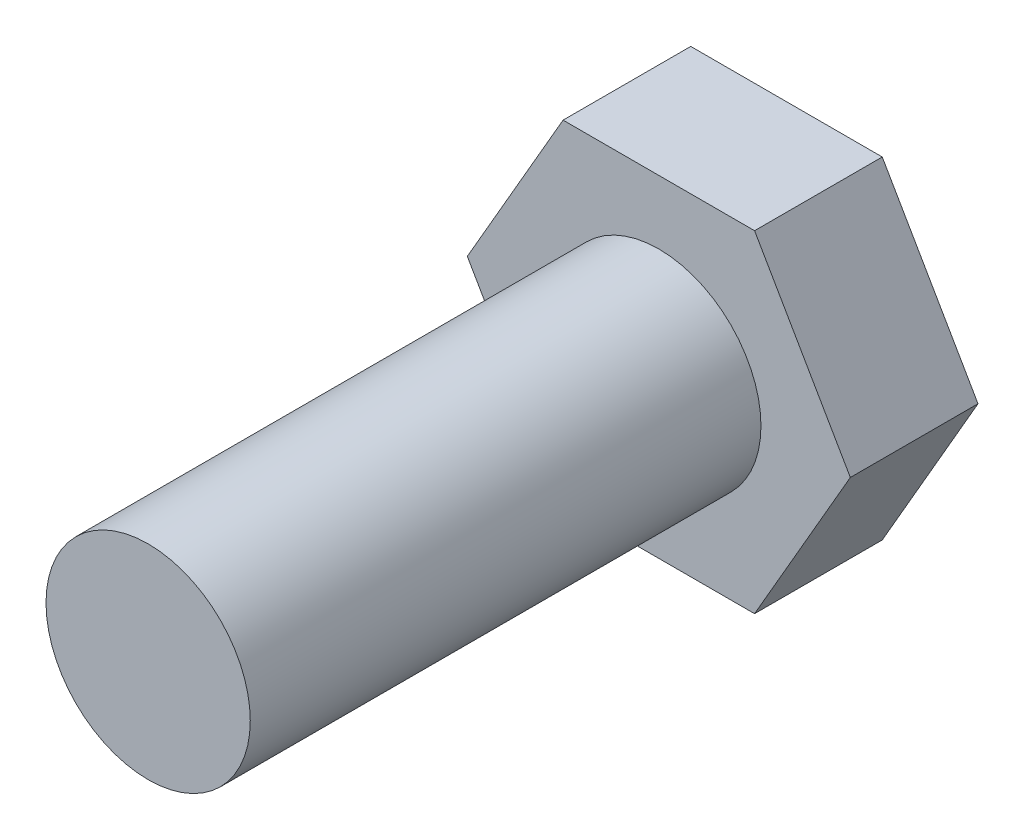
ISO-10303-21;
HEADER;
FILE_DESCRIPTION(('STEP AP214'),'2;1');
FILE_NAME('part.step','',(''),(''),'','','');
FILE_SCHEMA(('AUTOMOTIVE_DESIGN { 1 0 10303 214 1 1 1 1 }'));
ENDSEC;
DATA;
#1=APPLICATION_CONTEXT('core data for automotive mechanical design processes');
#2=APPLICATION_PROTOCOL_DEFINITION('international standard','automotive_design',2000,#1);
#3=PRODUCT_CONTEXT('',#1,'mechanical');
#4=PRODUCT('Part','Part','',(#3));
#5=PRODUCT_RELATED_PRODUCT_CATEGORY('part','',(#4));
#6=PRODUCT_DEFINITION_FORMATION('','',#4);
#7=PRODUCT_DEFINITION_CONTEXT('part definition',#1,'design');
#8=PRODUCT_DEFINITION('design','',#6,#7);
#9=PRODUCT_DEFINITION_SHAPE('','',#8);
#10=(LENGTH_UNIT() NAMED_UNIT(*) SI_UNIT(.MILLI.,.METRE.));
#11=(NAMED_UNIT(*) PLANE_ANGLE_UNIT() SI_UNIT($,.RADIAN.));
#12=(NAMED_UNIT(*) SI_UNIT($,.STERADIAN.) SOLID_ANGLE_UNIT());
#13=UNCERTAINTY_MEASURE_WITH_UNIT(LENGTH_MEASURE(1.E-05),#10,'distance_accuracy_value','');
#14=(GEOMETRIC_REPRESENTATION_CONTEXT(3) GLOBAL_UNCERTAINTY_ASSIGNED_CONTEXT((#13)) GLOBAL_UNIT_ASSIGNED_CONTEXT((#10,
#11,#12)) REPRESENTATION_CONTEXT('',''));
#15=CARTESIAN_POINT('',(0.,0.,0.));
#16=DIRECTION('',(0.,0.,1.));
#17=DIRECTION('',(1.,0.,0.));
#18=AXIS2_PLACEMENT_3D('',#15,#16,#17);
#19=CARTESIAN_POINT('',(7.50000000000015,-12.9903810567665,10.));
#20=DIRECTION('',(-0.866025403784442,0.499999999999995,0.));
#21=DIRECTION('',(-0.499999999999995,-0.866025403784442,0.));
#22=AXIS2_PLACEMENT_3D('',#19,#20,#21);
#23=PLANE('',#22);
#24=DIRECTION('',(0.499999999999995,0.866025403784442,0.));
#25=VECTOR('',#24,1.);
#26=CARTESIAN_POINT('',(7.50000000000015,-12.9903810567665,0.));
#27=LINE('',#26,#25);
#28=CARTESIAN_POINT('',(7.50000000000015,-12.9903810567665,0.));
#29=VERTEX_POINT('',#28);
#30=CARTESIAN_POINT('',(15.,0.,0.));
#31=VERTEX_POINT('',#30);
#32=EDGE_CURVE('E125',#29,#31,#27,.T.);
#33=ORIENTED_EDGE('',*,*,#32,.T.);
#34=DIRECTION('',(0.,0.,-1.));
#35=VECTOR('',#34,1.);
#36=CARTESIAN_POINT('',(15.,0.,10.));
#37=LINE('',#36,#35);
#38=CARTESIAN_POINT('',(15.,0.,10.));
#39=VERTEX_POINT('',#38);
#40=EDGE_CURVE('E11',#39,#31,#37,.T.);
#41=ORIENTED_EDGE('',*,*,#40,.F.);
#42=DIRECTION('',(0.499999999999995,0.866025403784442,0.));
#43=VECTOR('',#42,1.);
#44=CARTESIAN_POINT('',(7.50000000000015,-12.9903810567665,10.));
#45=LINE('',#44,#43);
#46=CARTESIAN_POINT('',(7.50000000000015,-12.9903810567665,10.));
#47=VERTEX_POINT('',#46);
#48=EDGE_CURVE('E136',#47,#39,#45,.T.);
#49=ORIENTED_EDGE('',*,*,#48,.F.);
#50=DIRECTION('',(0.,0.,-1.));
#51=VECTOR('',#50,1.);
#52=CARTESIAN_POINT('',(7.50000000000015,-12.9903810567665,10.));
#53=LINE('',#52,#51);
#54=EDGE_CURVE('E121',#47,#29,#53,.T.);
#55=ORIENTED_EDGE('',*,*,#54,.T.);
#56=EDGE_LOOP('',(#33,#41,#49,#55));
#57=FACE_BOUND('',#56,.T.);
#58=ADVANCED_FACE('F41',(#57),#23,.F.);
#59=CARTESIAN_POINT('',(15.,0.,10.));
#60=DIRECTION('',(-0.866025403784438,-0.500000000000001,0.));
#61=DIRECTION('',(0.500000000000001,-0.866025403784438,0.));
#62=AXIS2_PLACEMENT_3D('',#59,#60,#61);
#63=PLANE('',#62);
#64=DIRECTION('',(-0.500000000000001,0.866025403784438,0.));
#65=VECTOR('',#64,1.);
#66=CARTESIAN_POINT('',(15.,0.,0.));
#67=LINE('',#66,#65);
#68=CARTESIAN_POINT('',(7.49999999999997,12.9903810567666,0.));
#69=VERTEX_POINT('',#68);
#70=EDGE_CURVE('E128',#31,#69,#67,.T.);
#71=ORIENTED_EDGE('',*,*,#70,.T.);
#72=DIRECTION('',(0.,0.,-1.));
#73=VECTOR('',#72,1.);
#74=CARTESIAN_POINT('',(7.49999999999997,12.9903810567666,10.));
#75=LINE('',#74,#73);
#76=CARTESIAN_POINT('',(7.49999999999997,12.9903810567666,10.));
#77=VERTEX_POINT('',#76);
#78=EDGE_CURVE('E49',#77,#69,#75,.T.);
#79=ORIENTED_EDGE('',*,*,#78,.F.);
#80=DIRECTION('',(-0.500000000000001,0.866025403784438,0.));
#81=VECTOR('',#80,1.);
#82=CARTESIAN_POINT('',(15.,0.,10.));
#83=LINE('',#82,#81);
#84=EDGE_CURVE('E94',#39,#77,#83,.T.);
#85=ORIENTED_EDGE('',*,*,#84,.F.);
#86=ORIENTED_EDGE('',*,*,#40,.T.);
#87=EDGE_LOOP('',(#71,#79,#85,#86));
#88=FACE_BOUND('',#87,.T.);
#89=ADVANCED_FACE('F161',(#88),#63,.F.);
#90=CARTESIAN_POINT('',(7.49999999999997,12.9903810567666,10.));
#91=DIRECTION('',(0.,-1.,0.));
#92=DIRECTION('',(1.,0.,0.));
#93=AXIS2_PLACEMENT_3D('',#90,#91,#92);
#94=PLANE('',#93);
#95=DIRECTION('',(-1.,0.,0.));
#96=VECTOR('',#95,1.);
#97=CARTESIAN_POINT('',(7.49999999999997,12.9903810567666,0.));
#98=LINE('',#97,#96);
#99=CARTESIAN_POINT('',(-7.50000000000006,12.9903810567665,0.));
#100=VERTEX_POINT('',#99);
#101=EDGE_CURVE('E131',#69,#100,#98,.T.);
#102=ORIENTED_EDGE('',*,*,#101,.T.);
#103=DIRECTION('',(0.,0.,-1.));
#104=VECTOR('',#103,1.);
#105=CARTESIAN_POINT('',(-7.50000000000006,12.9903810567665,10.));
#106=LINE('',#105,#104);
#107=CARTESIAN_POINT('',(-7.50000000000006,12.9903810567665,10.));
#108=VERTEX_POINT('',#107);
#109=EDGE_CURVE('E116',#108,#100,#106,.T.);
#110=ORIENTED_EDGE('',*,*,#109,.F.);
#111=DIRECTION('',(-1.,0.,0.));
#112=VECTOR('',#111,1.);
#113=CARTESIAN_POINT('',(7.49999999999997,12.9903810567666,10.));
#114=LINE('',#113,#112);
#115=EDGE_CURVE('E107',#77,#108,#114,.T.);
#116=ORIENTED_EDGE('',*,*,#115,.F.);
#117=ORIENTED_EDGE('',*,*,#78,.T.);
#118=EDGE_LOOP('',(#102,#110,#116,#117));
#119=FACE_BOUND('',#118,.T.);
#120=ADVANCED_FACE('F142',(#119),#94,.F.);
#121=CARTESIAN_POINT('',(-7.50000000000006,12.9903810567665,10.));
#122=DIRECTION('',(0.866025403784442,-0.499999999999995,0.));
#123=DIRECTION('',(0.499999999999995,0.866025403784441,0.));
#124=AXIS2_PLACEMENT_3D('',#121,#122,#123);
#125=PLANE('',#124);
#126=DIRECTION('',(-0.499999999999995,-0.866025403784442,0.));
#127=VECTOR('',#126,1.);
#128=CARTESIAN_POINT('',(-7.50000000000006,12.9903810567665,0.));
#129=LINE('',#128,#127);
#130=CARTESIAN_POINT('',(-15.,-1.04744440165294E-13,0.));
#131=VERTEX_POINT('',#130);
#132=EDGE_CURVE('E115',#100,#131,#129,.T.);
#133=ORIENTED_EDGE('',*,*,#132,.T.);
#134=DIRECTION('',(0.,0.,-1.));
#135=VECTOR('',#134,1.);
#136=CARTESIAN_POINT('',(-15.,-1.04744440165294E-13,10.));
#137=LINE('',#136,#135);
#138=CARTESIAN_POINT('',(-15.,-1.04744440165294E-13,10.));
#139=VERTEX_POINT('',#138);
#140=EDGE_CURVE('E112',#139,#131,#137,.T.);
#141=ORIENTED_EDGE('',*,*,#140,.F.);
#142=DIRECTION('',(-0.499999999999995,-0.866025403784442,0.));
#143=VECTOR('',#142,1.);
#144=CARTESIAN_POINT('',(-7.50000000000006,12.9903810567665,10.));
#145=LINE('',#144,#143);
#146=EDGE_CURVE('E101',#108,#139,#145,.T.);
#147=ORIENTED_EDGE('',*,*,#146,.F.);
#148=ORIENTED_EDGE('',*,*,#109,.T.);
#149=EDGE_LOOP('',(#133,#141,#147,#148));
#150=FACE_BOUND('',#149,.T.);
#151=ADVANCED_FACE('F113',(#150),#125,.F.);
#152=CARTESIAN_POINT('',(-15.,-1.04744440165294E-13,10.));
#153=DIRECTION('',(0.866025403784435,0.500000000000007,0.));
#154=DIRECTION('',(-0.500000000000007,0.866025403784435,0.));
#155=AXIS2_PLACEMENT_3D('',#152,#153,#154);
#156=PLANE('',#155);
#157=DIRECTION('',(0.500000000000007,-0.866025403784435,0.));
#158=VECTOR('',#157,1.);
#159=CARTESIAN_POINT('',(-15.,-1.04744440165294E-13,0.));
#160=LINE('',#159,#158);
#161=CARTESIAN_POINT('',(-7.49999999999988,-12.9903810567666,0.));
#162=VERTEX_POINT('',#161);
#163=EDGE_CURVE('E80',#131,#162,#160,.T.);
#164=ORIENTED_EDGE('',*,*,#163,.T.);
#165=DIRECTION('',(0.,0.,-1.));
#166=VECTOR('',#165,1.);
#167=CARTESIAN_POINT('',(-7.49999999999988,-12.9903810567666,10.));
#168=LINE('',#167,#166);
#169=CARTESIAN_POINT('',(-7.49999999999988,-12.9903810567666,10.));
#170=VERTEX_POINT('',#169);
#171=EDGE_CURVE('E117',#170,#162,#168,.T.);
#172=ORIENTED_EDGE('',*,*,#171,.F.);
#173=DIRECTION('',(0.500000000000007,-0.866025403784435,0.));
#174=VECTOR('',#173,1.);
#175=CARTESIAN_POINT('',(-15.,-1.04744440165294E-13,10.));
#176=LINE('',#175,#174);
#177=EDGE_CURVE('E105',#139,#170,#176,.T.);
#178=ORIENTED_EDGE('',*,*,#177,.F.);
#179=ORIENTED_EDGE('',*,*,#140,.T.);
#180=EDGE_LOOP('',(#164,#172,#178,#179));
#181=FACE_BOUND('',#180,.T.);
#182=ADVANCED_FACE('F119',(#181),#156,.F.);
#183=CARTESIAN_POINT('',(-7.49999999999988,-12.9903810567666,10.));
#184=DIRECTION('',(0.,1.,0.));
#185=DIRECTION('',(-1.,0.,0.));
#186=AXIS2_PLACEMENT_3D('',#183,#184,#185);
#187=PLANE('',#186);
#188=DIRECTION('',(1.,0.,0.));
#189=VECTOR('',#188,1.);
#190=CARTESIAN_POINT('',(-7.49999999999988,-12.9903810567666,0.));
#191=LINE('',#190,#189);
#192=EDGE_CURVE('E86',#162,#29,#191,.T.);
#193=ORIENTED_EDGE('',*,*,#192,.T.);
#194=ORIENTED_EDGE('',*,*,#54,.F.);
#195=DIRECTION('',(1.,0.,0.));
#196=VECTOR('',#195,1.);
#197=CARTESIAN_POINT('',(-7.49999999999988,-12.9903810567666,10.));
#198=LINE('',#197,#196);
#199=EDGE_CURVE('E57',#170,#47,#198,.T.);
#200=ORIENTED_EDGE('',*,*,#199,.F.);
#201=ORIENTED_EDGE('',*,*,#171,.T.);
#202=EDGE_LOOP('',(#193,#194,#200,#201));
#203=FACE_BOUND('',#202,.T.);
#204=ADVANCED_FACE('F149',(#203),#187,.F.);
#205=CARTESIAN_POINT('',(0.,0.,10.));
#206=DIRECTION('',(0.,0.,1.));
#207=DIRECTION('',(1.,0.,0.));
#208=AXIS2_PLACEMENT_3D('',#205,#206,#207);
#209=PLANE('',#208);
#210=CARTESIAN_POINT('',(0.,0.,10.));
#211=DIRECTION('',(0.,0.,1.));
#212=DIRECTION('',(1.,0.,0.));
#213=AXIS2_PLACEMENT_3D('',#210,#211,#212);
#214=CIRCLE('',#213,8.);
#215=CARTESIAN_POINT('',(8.,0.,10.));
#216=VERTEX_POINT('',#215);
#217=EDGE_CURVE('E129',#216,#216,#214,.F.);
#218=ORIENTED_EDGE('',*,*,#217,.T.);
#219=EDGE_LOOP('',(#218));
#220=FACE_BOUND('',#219,.T.);
#221=ORIENTED_EDGE('',*,*,#48,.T.);
#222=ORIENTED_EDGE('',*,*,#84,.T.);
#223=ORIENTED_EDGE('',*,*,#115,.T.);
#224=ORIENTED_EDGE('',*,*,#146,.T.);
#225=ORIENTED_EDGE('',*,*,#177,.T.);
#226=ORIENTED_EDGE('',*,*,#199,.T.);
#227=EDGE_LOOP('',(#221,#222,#223,#224,#225,#226));
#228=FACE_BOUND('',#227,.T.);
#229=ADVANCED_FACE('F103',(#220,#228),#209,.T.);
#230=CARTESIAN_POINT('',(0.,0.,0.));
#231=DIRECTION('',(0.,0.,1.));
#232=DIRECTION('',(1.,0.,0.));
#233=AXIS2_PLACEMENT_3D('',#230,#231,#232);
#234=PLANE('',#233);
#235=CARTESIAN_POINT('',(0.,0.,0.));
#236=DIRECTION('',(0.,0.,1.));
#237=DIRECTION('',(1.,0.,0.));
#238=AXIS2_PLACEMENT_3D('',#235,#236,#237);
#239=CIRCLE('',#238,4.);
#240=CARTESIAN_POINT('',(4.,0.,0.));
#241=VERTEX_POINT('',#240);
#242=EDGE_CURVE('E246',#241,#241,#239,.T.);
#243=ORIENTED_EDGE('',*,*,#242,.T.);
#244=EDGE_LOOP('',(#243));
#245=FACE_BOUND('',#244,.T.);
#246=ORIENTED_EDGE('',*,*,#32,.F.);
#247=ORIENTED_EDGE('',*,*,#192,.F.);
#248=ORIENTED_EDGE('',*,*,#163,.F.);
#249=ORIENTED_EDGE('',*,*,#132,.F.);
#250=ORIENTED_EDGE('',*,*,#101,.F.);
#251=ORIENTED_EDGE('',*,*,#70,.F.);
#252=EDGE_LOOP('',(#246,#247,#248,#249,#250,#251));
#253=FACE_BOUND('',#252,.T.);
#254=ADVANCED_FACE('F145',(#245,#253),#234,.F.);
#255=CARTESIAN_POINT('',(0.,0.,50.));
#256=DIRECTION('',(0.,0.,-1.));
#257=DIRECTION('',(-1.,0.,0.));
#258=AXIS2_PLACEMENT_3D('',#255,#256,#257);
#259=CYLINDRICAL_SURFACE('',#258,8.);
#260=ORIENTED_EDGE('',*,*,#217,.F.);
#261=EDGE_LOOP('',(#260));
#262=FACE_BOUND('',#261,.T.);
#263=CARTESIAN_POINT('',(0.,0.,50.));
#264=DIRECTION('',(0.,0.,1.));
#265=DIRECTION('',(1.,0.,0.));
#266=AXIS2_PLACEMENT_3D('',#263,#264,#265);
#267=CIRCLE('',#266,8.);
#268=CARTESIAN_POINT('',(8.,0.,50.));
#269=VERTEX_POINT('',#268);
#270=EDGE_CURVE('E245',#269,#269,#267,.T.);
#271=ORIENTED_EDGE('',*,*,#270,.F.);
#272=EDGE_LOOP('',(#271));
#273=FACE_BOUND('',#272,.T.);
#274=ADVANCED_FACE('F201',(#262,#273),#259,.T.);
#275=CARTESIAN_POINT('',(0.,0.,50.));
#276=DIRECTION('',(0.,0.,1.));
#277=DIRECTION('',(1.,0.,0.));
#278=AXIS2_PLACEMENT_3D('',#275,#276,#277);
#279=PLANE('',#278);
#280=ORIENTED_EDGE('',*,*,#270,.T.);
#281=EDGE_LOOP('',(#280));
#282=FACE_BOUND('',#281,.T.);
#283=ADVANCED_FACE('F211',(#282),#279,.T.);
#284=CARTESIAN_POINT('',(0.,0.,15.));
#285=DIRECTION('',(0.,0.,-1.));
#286=DIRECTION('',(-1.,0.,0.));
#287=AXIS2_PLACEMENT_3D('',#284,#285,#286);
#288=CYLINDRICAL_SURFACE('',#287,4.);
#289=CARTESIAN_POINT('',(0.,0.,15.));
#290=DIRECTION('',(0.,0.,1.));
#291=DIRECTION('',(1.,0.,0.));
#292=AXIS2_PLACEMENT_3D('',#289,#290,#291);
#293=CIRCLE('',#292,4.);
#294=CARTESIAN_POINT('',(4.,0.,15.));
#295=VERTEX_POINT('',#294);
#296=EDGE_CURVE('E244',#295,#295,#293,.T.);
#297=ORIENTED_EDGE('',*,*,#296,.T.);
#298=EDGE_LOOP('',(#297));
#299=FACE_BOUND('',#298,.T.);
#300=ORIENTED_EDGE('',*,*,#242,.F.);
#301=EDGE_LOOP('',(#300));
#302=FACE_BOUND('',#301,.T.);
#303=ADVANCED_FACE('F220',(#299,#302),#288,.F.);
#304=CARTESIAN_POINT('',(0.,0.,15.));
#305=DIRECTION('',(0.,0.,1.));
#306=DIRECTION('',(1.,0.,0.));
#307=AXIS2_PLACEMENT_3D('',#304,#305,#306);
#308=PLANE('',#307);
#309=ORIENTED_EDGE('',*,*,#296,.F.);
#310=EDGE_LOOP('',(#309));
#311=FACE_BOUND('',#310,.T.);
#312=ADVANCED_FACE('F229',(#311),#308,.F.);
#313=CLOSED_SHELL('',(#58,#89,#120,#151,#182,#204,#229,#254,#274,#283,#303,#312));
#314=MANIFOLD_SOLID_BREP('B2',#313);
#315=ADVANCED_BREP_SHAPE_REPRESENTATION('',(#18,#314),#14);
#316=SHAPE_DEFINITION_REPRESENTATION(#9,#315);
ENDSEC;
END-ISO-10303-21;
